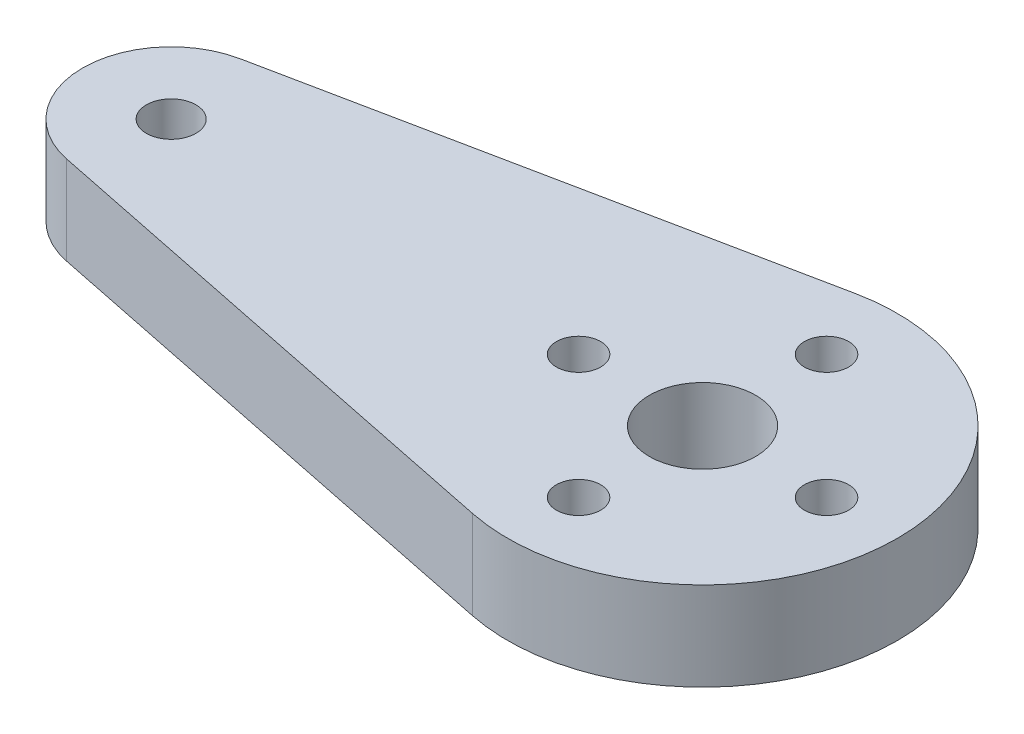
ISO-10303-21;
HEADER;
FILE_DESCRIPTION(('STEP AP214'),'2;1');
FILE_NAME('part.step','',(''),(''),'','','');
FILE_SCHEMA(('AUTOMOTIVE_DESIGN { 1 0 10303 214 1 1 1 1 }'));
ENDSEC;
DATA;
#1=APPLICATION_CONTEXT('core data for automotive mechanical design processes');
#2=APPLICATION_PROTOCOL_DEFINITION('international standard','automotive_design',2000,#1);
#3=PRODUCT_CONTEXT('',#1,'mechanical');
#4=PRODUCT('Part','Part','',(#3));
#5=PRODUCT_RELATED_PRODUCT_CATEGORY('part','',(#4));
#6=PRODUCT_DEFINITION_FORMATION('','',#4);
#7=PRODUCT_DEFINITION_CONTEXT('part definition',#1,'design');
#8=PRODUCT_DEFINITION('design','',#6,#7);
#9=PRODUCT_DEFINITION_SHAPE('','',#8);
#10=(LENGTH_UNIT() NAMED_UNIT(*) SI_UNIT(.MILLI.,.METRE.));
#11=(NAMED_UNIT(*) PLANE_ANGLE_UNIT() SI_UNIT($,.RADIAN.));
#12=(NAMED_UNIT(*) SI_UNIT($,.STERADIAN.) SOLID_ANGLE_UNIT());
#13=UNCERTAINTY_MEASURE_WITH_UNIT(LENGTH_MEASURE(1.E-05),#10,'distance_accuracy_value','');
#14=(GEOMETRIC_REPRESENTATION_CONTEXT(3) GLOBAL_UNCERTAINTY_ASSIGNED_CONTEXT((#13)) GLOBAL_UNIT_ASSIGNED_CONTEXT((#10,
#11,#12)) REPRESENTATION_CONTEXT('',''));
#15=CARTESIAN_POINT('',(0.,0.,0.));
#16=DIRECTION('',(0.,0.,1.));
#17=DIRECTION('',(1.,0.,0.));
#18=AXIS2_PLACEMENT_3D('',#15,#16,#17);
#19=CARTESIAN_POINT('',(0.,5.,0.));
#20=DIRECTION('',(0.,1.,0.));
#21=DIRECTION('',(0.,0.,1.));
#22=AXIS2_PLACEMENT_3D('',#19,#20,#21);
#23=PLANE('',#22);
#24=CARTESIAN_POINT('',(37.,5.,0.));
#25=DIRECTION('',(0.,1.,0.));
#26=DIRECTION('',(0.,0.,1.));
#27=AXIS2_PLACEMENT_3D('',#24,#25,#26);
#28=CIRCLE('',#27,1.25);
#29=CARTESIAN_POINT('',(37.,5.,1.25000000000005));
#30=VERTEX_POINT('',#29);
#31=EDGE_CURVE('E164',#30,#30,#28,.T.);
#32=ORIENTED_EDGE('',*,*,#31,.F.);
#33=EDGE_LOOP('',(#32));
#34=FACE_BOUND('',#33,.T.);
#35=CARTESIAN_POINT('',(0.,5.,0.));
#36=DIRECTION('',(0.,1.,0.));
#37=DIRECTION('',(0.,0.,1.));
#38=AXIS2_PLACEMENT_3D('',#35,#36,#37);
#39=CIRCLE('',#38,1.4);
#40=CARTESIAN_POINT('',(0.,5.,1.4));
#41=VERTEX_POINT('',#40);
#42=EDGE_CURVE('E148',#41,#41,#39,.T.);
#43=ORIENTED_EDGE('',*,*,#42,.F.);
#44=EDGE_LOOP('',(#43));
#45=FACE_BOUND('',#44,.T.);
#46=CARTESIAN_POINT('',(30.,5.,0.));
#47=DIRECTION('',(0.,1.,0.));
#48=DIRECTION('',(0.,0.,1.));
#49=AXIS2_PLACEMENT_3D('',#46,#47,#48);
#50=CIRCLE('',#49,3.);
#51=CARTESIAN_POINT('',(30.,5.,3.));
#52=VERTEX_POINT('',#51);
#53=EDGE_CURVE('E118',#52,#52,#50,.T.);
#54=ORIENTED_EDGE('',*,*,#53,.F.);
#55=EDGE_LOOP('',(#54));
#56=FACE_BOUND('',#55,.T.);
#57=CARTESIAN_POINT('',(0.,5.,0.));
#58=DIRECTION('',(0.,1.,0.));
#59=DIRECTION('',(0.,0.,1.));
#60=AXIS2_PLACEMENT_3D('',#57,#58,#59);
#61=CIRCLE('',#60,5.);
#62=CARTESIAN_POINT('',(-1.,5.,-4.89897948556636));
#63=VERTEX_POINT('',#62);
#64=CARTESIAN_POINT('',(-1.,5.,4.89897948556636));
#65=VERTEX_POINT('',#64);
#66=EDGE_CURVE('E98',#63,#65,#61,.T.);
#67=ORIENTED_EDGE('',*,*,#66,.T.);
#68=DIRECTION('',(0.979795897113271,0.,0.2));
#69=VECTOR('',#68,1.);
#70=CARTESIAN_POINT('',(-1.,5.,4.89897948556636));
#71=LINE('',#70,#69);
#72=CARTESIAN_POINT('',(27.8,5.,10.777754868246));
#73=VERTEX_POINT('',#72);
#74=EDGE_CURVE('E93',#65,#73,#71,.T.);
#75=ORIENTED_EDGE('',*,*,#74,.T.);
#76=CARTESIAN_POINT('',(30.,5.,0.));
#77=DIRECTION('',(0.,1.,0.));
#78=DIRECTION('',(0.,0.,1.));
#79=AXIS2_PLACEMENT_3D('',#76,#77,#78);
#80=CIRCLE('',#79,11.);
#81=CARTESIAN_POINT('',(27.8,5.,-10.777754868246));
#82=VERTEX_POINT('',#81);
#83=EDGE_CURVE('E96',#73,#82,#80,.T.);
#84=ORIENTED_EDGE('',*,*,#83,.T.);
#85=DIRECTION('',(-0.979795897113271,0.,0.2));
#86=VECTOR('',#85,1.);
#87=CARTESIAN_POINT('',(-1.,5.,-4.89897948556636));
#88=LINE('',#87,#86);
#89=EDGE_CURVE('E63',#82,#63,#88,.T.);
#90=ORIENTED_EDGE('',*,*,#89,.T.);
#91=EDGE_LOOP('',(#67,#75,#84,#90));
#92=FACE_BOUND('',#91,.T.);
#93=CARTESIAN_POINT('',(23.,5.,0.));
#94=DIRECTION('',(0.,1.,0.));
#95=DIRECTION('',(0.,0.,1.));
#96=AXIS2_PLACEMENT_3D('',#93,#94,#95);
#97=CIRCLE('',#96,1.25);
#98=CARTESIAN_POINT('',(23.,5.,1.25));
#99=VERTEX_POINT('',#98);
#100=EDGE_CURVE('E140',#99,#99,#97,.T.);
#101=ORIENTED_EDGE('',*,*,#100,.F.);
#102=EDGE_LOOP('',(#101));
#103=FACE_BOUND('',#102,.T.);
#104=CARTESIAN_POINT('',(30.,5.,-7.));
#105=DIRECTION('',(0.,1.,0.));
#106=DIRECTION('',(0.,0.,1.));
#107=AXIS2_PLACEMENT_3D('',#104,#105,#106);
#108=CIRCLE('',#107,1.25);
#109=CARTESIAN_POINT('',(30.,5.,-5.75));
#110=VERTEX_POINT('',#109);
#111=EDGE_CURVE('E156',#110,#110,#108,.T.);
#112=ORIENTED_EDGE('',*,*,#111,.F.);
#113=EDGE_LOOP('',(#112));
#114=FACE_BOUND('',#113,.T.);
#115=CARTESIAN_POINT('',(29.9999999999999,5.,7.));
#116=DIRECTION('',(0.,1.,0.));
#117=DIRECTION('',(0.,0.,1.));
#118=AXIS2_PLACEMENT_3D('',#115,#116,#117);
#119=CIRCLE('',#118,1.25);
#120=CARTESIAN_POINT('',(29.9999999999999,5.,8.25));
#121=VERTEX_POINT('',#120);
#122=EDGE_CURVE('E172',#121,#121,#119,.T.);
#123=ORIENTED_EDGE('',*,*,#122,.F.);
#124=EDGE_LOOP('',(#123));
#125=FACE_BOUND('',#124,.T.);
#126=ADVANCED_FACE('F45',(#34,#45,#56,#92,#103,#114,#125),#23,.T.);
#127=CARTESIAN_POINT('',(0.,0.,0.));
#128=DIRECTION('',(0.,1.,0.));
#129=DIRECTION('',(0.,0.,1.));
#130=AXIS2_PLACEMENT_3D('',#127,#128,#129);
#131=PLANE('',#130);
#132=CARTESIAN_POINT('',(0.,0.,0.));
#133=DIRECTION('',(0.,1.,0.));
#134=DIRECTION('',(0.,0.,1.));
#135=AXIS2_PLACEMENT_3D('',#132,#133,#134);
#136=CIRCLE('',#135,5.);
#137=CARTESIAN_POINT('',(-1.,0.,-4.89897948556636));
#138=VERTEX_POINT('',#137);
#139=CARTESIAN_POINT('',(-1.,0.,4.89897948556636));
#140=VERTEX_POINT('',#139);
#141=EDGE_CURVE('E114',#138,#140,#136,.T.);
#142=ORIENTED_EDGE('',*,*,#141,.F.);
#143=DIRECTION('',(-0.979795897113271,0.,0.2));
#144=VECTOR('',#143,1.);
#145=CARTESIAN_POINT('',(-1.,0.,-4.89897948556636));
#146=LINE('',#145,#144);
#147=CARTESIAN_POINT('',(27.8,0.,-10.777754868246));
#148=VERTEX_POINT('',#147);
#149=EDGE_CURVE('E86',#148,#138,#146,.T.);
#150=ORIENTED_EDGE('',*,*,#149,.F.);
#151=CARTESIAN_POINT('',(30.,0.,0.));
#152=DIRECTION('',(0.,1.,0.));
#153=DIRECTION('',(0.,0.,1.));
#154=AXIS2_PLACEMENT_3D('',#151,#152,#153);
#155=CIRCLE('',#154,11.);
#156=CARTESIAN_POINT('',(27.8,0.,10.777754868246));
#157=VERTEX_POINT('',#156);
#158=EDGE_CURVE('E80',#157,#148,#155,.T.);
#159=ORIENTED_EDGE('',*,*,#158,.F.);
#160=DIRECTION('',(0.979795897113271,0.,0.2));
#161=VECTOR('',#160,1.);
#162=CARTESIAN_POINT('',(-1.,0.,4.89897948556636));
#163=LINE('',#162,#161);
#164=EDGE_CURVE('E103',#140,#157,#163,.T.);
#165=ORIENTED_EDGE('',*,*,#164,.F.);
#166=EDGE_LOOP('',(#142,#150,#159,#165));
#167=FACE_BOUND('',#166,.T.);
#168=CARTESIAN_POINT('',(30.,0.,0.));
#169=DIRECTION('',(0.,1.,0.));
#170=DIRECTION('',(0.,0.,1.));
#171=AXIS2_PLACEMENT_3D('',#168,#169,#170);
#172=CIRCLE('',#171,3.);
#173=CARTESIAN_POINT('',(30.,0.,3.));
#174=VERTEX_POINT('',#173);
#175=EDGE_CURVE('E136',#174,#174,#172,.T.);
#176=ORIENTED_EDGE('',*,*,#175,.T.);
#177=EDGE_LOOP('',(#176));
#178=FACE_BOUND('',#177,.T.);
#179=CARTESIAN_POINT('',(23.,0.,0.));
#180=DIRECTION('',(0.,1.,0.));
#181=DIRECTION('',(0.,0.,1.));
#182=AXIS2_PLACEMENT_3D('',#179,#180,#181);
#183=CIRCLE('',#182,1.25);
#184=CARTESIAN_POINT('',(23.,0.,1.25));
#185=VERTEX_POINT('',#184);
#186=EDGE_CURVE('E144',#185,#185,#183,.T.);
#187=ORIENTED_EDGE('',*,*,#186,.T.);
#188=EDGE_LOOP('',(#187));
#189=FACE_BOUND('',#188,.T.);
#190=CARTESIAN_POINT('',(0.,0.,0.));
#191=DIRECTION('',(0.,1.,0.));
#192=DIRECTION('',(0.,0.,1.));
#193=AXIS2_PLACEMENT_3D('',#190,#191,#192);
#194=CIRCLE('',#193,1.4);
#195=CARTESIAN_POINT('',(0.,0.,1.4));
#196=VERTEX_POINT('',#195);
#197=EDGE_CURVE('E152',#196,#196,#194,.T.);
#198=ORIENTED_EDGE('',*,*,#197,.T.);
#199=EDGE_LOOP('',(#198));
#200=FACE_BOUND('',#199,.T.);
#201=CARTESIAN_POINT('',(30.,0.,-7.));
#202=DIRECTION('',(0.,1.,0.));
#203=DIRECTION('',(0.,0.,1.));
#204=AXIS2_PLACEMENT_3D('',#201,#202,#203);
#205=CIRCLE('',#204,1.25);
#206=CARTESIAN_POINT('',(30.,0.,-5.75));
#207=VERTEX_POINT('',#206);
#208=EDGE_CURVE('E160',#207,#207,#205,.T.);
#209=ORIENTED_EDGE('',*,*,#208,.T.);
#210=EDGE_LOOP('',(#209));
#211=FACE_BOUND('',#210,.T.);
#212=CARTESIAN_POINT('',(37.,0.,0.));
#213=DIRECTION('',(0.,1.,0.));
#214=DIRECTION('',(0.,0.,1.));
#215=AXIS2_PLACEMENT_3D('',#212,#213,#214);
#216=CIRCLE('',#215,1.25);
#217=CARTESIAN_POINT('',(37.,0.,1.25000000000005));
#218=VERTEX_POINT('',#217);
#219=EDGE_CURVE('E168',#218,#218,#216,.T.);
#220=ORIENTED_EDGE('',*,*,#219,.T.);
#221=EDGE_LOOP('',(#220));
#222=FACE_BOUND('',#221,.T.);
#223=CARTESIAN_POINT('',(29.9999999999999,0.,7.));
#224=DIRECTION('',(0.,1.,0.));
#225=DIRECTION('',(0.,0.,1.));
#226=AXIS2_PLACEMENT_3D('',#223,#224,#225);
#227=CIRCLE('',#226,1.25);
#228=CARTESIAN_POINT('',(29.9999999999999,0.,8.25));
#229=VERTEX_POINT('',#228);
#230=EDGE_CURVE('E176',#229,#229,#227,.T.);
#231=ORIENTED_EDGE('',*,*,#230,.T.);
#232=EDGE_LOOP('',(#231));
#233=FACE_BOUND('',#232,.T.);
#234=ADVANCED_FACE('F131',(#167,#178,#189,#200,#211,#222,#233),#131,.F.);
#235=CARTESIAN_POINT('',(0.,5.,0.));
#236=DIRECTION('',(0.,-1.,0.));
#237=DIRECTION('',(0.,0.,-1.));
#238=AXIS2_PLACEMENT_3D('',#235,#236,#237);
#239=CYLINDRICAL_SURFACE('',#238,5.);
#240=ORIENTED_EDGE('',*,*,#141,.T.);
#241=DIRECTION('',(0.,-1.,0.));
#242=VECTOR('',#241,1.);
#243=CARTESIAN_POINT('',(-1.,5.,4.89897948556636));
#244=LINE('',#243,#242);
#245=EDGE_CURVE('E11',#65,#140,#244,.T.);
#246=ORIENTED_EDGE('',*,*,#245,.F.);
#247=ORIENTED_EDGE('',*,*,#66,.F.);
#248=DIRECTION('',(0.,-1.,0.));
#249=VECTOR('',#248,1.);
#250=CARTESIAN_POINT('',(-1.,5.,-4.89897948556636));
#251=LINE('',#250,#249);
#252=EDGE_CURVE('E110',#63,#138,#251,.T.);
#253=ORIENTED_EDGE('',*,*,#252,.T.);
#254=EDGE_LOOP('',(#240,#246,#247,#253));
#255=FACE_BOUND('',#254,.T.);
#256=ADVANCED_FACE('F47',(#255),#239,.T.);
#257=CARTESIAN_POINT('',(-1.,5.,4.89897948556636));
#258=DIRECTION('',(0.2,0.,-0.979795897113271));
#259=DIRECTION('',(-0.979795897113271,0.,-0.2));
#260=AXIS2_PLACEMENT_3D('',#257,#258,#259);
#261=PLANE('',#260);
#262=ORIENTED_EDGE('',*,*,#164,.T.);
#263=DIRECTION('',(0.,-1.,0.));
#264=VECTOR('',#263,1.);
#265=CARTESIAN_POINT('',(27.8,5.,10.777754868246));
#266=LINE('',#265,#264);
#267=EDGE_CURVE('E55',#73,#157,#266,.T.);
#268=ORIENTED_EDGE('',*,*,#267,.F.);
#269=ORIENTED_EDGE('',*,*,#74,.F.);
#270=ORIENTED_EDGE('',*,*,#245,.T.);
#271=EDGE_LOOP('',(#262,#268,#269,#270));
#272=FACE_BOUND('',#271,.T.);
#273=ADVANCED_FACE('F102',(#272),#261,.F.);
#274=CARTESIAN_POINT('',(30.,5.,0.));
#275=DIRECTION('',(0.,-1.,0.));
#276=DIRECTION('',(0.,0.,-1.));
#277=AXIS2_PLACEMENT_3D('',#274,#275,#276);
#278=CYLINDRICAL_SURFACE('',#277,11.);
#279=ORIENTED_EDGE('',*,*,#158,.T.);
#280=DIRECTION('',(0.,-1.,0.));
#281=VECTOR('',#280,1.);
#282=CARTESIAN_POINT('',(27.8,5.,-10.777754868246));
#283=LINE('',#282,#281);
#284=EDGE_CURVE('E105',#82,#148,#283,.T.);
#285=ORIENTED_EDGE('',*,*,#284,.F.);
#286=ORIENTED_EDGE('',*,*,#83,.F.);
#287=ORIENTED_EDGE('',*,*,#267,.T.);
#288=EDGE_LOOP('',(#279,#285,#286,#287));
#289=FACE_BOUND('',#288,.T.);
#290=ADVANCED_FACE('F106',(#289),#278,.T.);
#291=CARTESIAN_POINT('',(-1.,5.,-4.89897948556636));
#292=DIRECTION('',(0.2,0.,0.979795897113271));
#293=DIRECTION('',(0.979795897113271,0.,-0.2));
#294=AXIS2_PLACEMENT_3D('',#291,#292,#293);
#295=PLANE('',#294);
#296=ORIENTED_EDGE('',*,*,#149,.T.);
#297=ORIENTED_EDGE('',*,*,#252,.F.);
#298=ORIENTED_EDGE('',*,*,#89,.F.);
#299=ORIENTED_EDGE('',*,*,#284,.T.);
#300=EDGE_LOOP('',(#296,#297,#298,#299));
#301=FACE_BOUND('',#300,.T.);
#302=ADVANCED_FACE('F128',(#301),#295,.F.);
#303=CARTESIAN_POINT('',(30.,5.,0.));
#304=DIRECTION('',(0.,-1.,0.));
#305=DIRECTION('',(0.,0.,-1.));
#306=AXIS2_PLACEMENT_3D('',#303,#304,#305);
#307=CYLINDRICAL_SURFACE('',#306,3.);
#308=ORIENTED_EDGE('',*,*,#53,.T.);
#309=EDGE_LOOP('',(#308));
#310=FACE_BOUND('',#309,.T.);
#311=ORIENTED_EDGE('',*,*,#175,.F.);
#312=EDGE_LOOP('',(#311));
#313=FACE_BOUND('',#312,.T.);
#314=ADVANCED_FACE('F197',(#310,#313),#307,.F.);
#315=CARTESIAN_POINT('',(23.,5.,0.));
#316=DIRECTION('',(0.,-1.,0.));
#317=DIRECTION('',(0.,0.,-1.));
#318=AXIS2_PLACEMENT_3D('',#315,#316,#317);
#319=CYLINDRICAL_SURFACE('',#318,1.25);
#320=ORIENTED_EDGE('',*,*,#100,.T.);
#321=EDGE_LOOP('',(#320));
#322=FACE_BOUND('',#321,.T.);
#323=ORIENTED_EDGE('',*,*,#186,.F.);
#324=EDGE_LOOP('',(#323));
#325=FACE_BOUND('',#324,.T.);
#326=ADVANCED_FACE('F242',(#322,#325),#319,.F.);
#327=CARTESIAN_POINT('',(0.,5.,0.));
#328=DIRECTION('',(0.,-1.,0.));
#329=DIRECTION('',(0.,0.,-1.));
#330=AXIS2_PLACEMENT_3D('',#327,#328,#329);
#331=CYLINDRICAL_SURFACE('',#330,1.4);
#332=ORIENTED_EDGE('',*,*,#42,.T.);
#333=EDGE_LOOP('',(#332));
#334=FACE_BOUND('',#333,.T.);
#335=ORIENTED_EDGE('',*,*,#197,.F.);
#336=EDGE_LOOP('',(#335));
#337=FACE_BOUND('',#336,.T.);
#338=ADVANCED_FACE('F250',(#334,#337),#331,.F.);
#339=CARTESIAN_POINT('',(30.,5.,-7.));
#340=DIRECTION('',(0.,-1.,0.));
#341=DIRECTION('',(0.,0.,-1.));
#342=AXIS2_PLACEMENT_3D('',#339,#340,#341);
#343=CYLINDRICAL_SURFACE('',#342,1.25);
#344=ORIENTED_EDGE('',*,*,#111,.T.);
#345=EDGE_LOOP('',(#344));
#346=FACE_BOUND('',#345,.T.);
#347=ORIENTED_EDGE('',*,*,#208,.F.);
#348=EDGE_LOOP('',(#347));
#349=FACE_BOUND('',#348,.T.);
#350=ADVANCED_FACE('F258',(#346,#349),#343,.F.);
#351=CARTESIAN_POINT('',(37.,5.,0.));
#352=DIRECTION('',(0.,-1.,0.));
#353=DIRECTION('',(0.,0.,-1.));
#354=AXIS2_PLACEMENT_3D('',#351,#352,#353);
#355=CYLINDRICAL_SURFACE('',#354,1.25);
#356=ORIENTED_EDGE('',*,*,#31,.T.);
#357=EDGE_LOOP('',(#356));
#358=FACE_BOUND('',#357,.T.);
#359=ORIENTED_EDGE('',*,*,#219,.F.);
#360=EDGE_LOOP('',(#359));
#361=FACE_BOUND('',#360,.T.);
#362=ADVANCED_FACE('F267',(#358,#361),#355,.F.);
#363=CARTESIAN_POINT('',(29.9999999999999,5.,7.));
#364=DIRECTION('',(0.,-1.,0.));
#365=DIRECTION('',(0.,0.,-1.));
#366=AXIS2_PLACEMENT_3D('',#363,#364,#365);
#367=CYLINDRICAL_SURFACE('',#366,1.25);
#368=ORIENTED_EDGE('',*,*,#122,.T.);
#369=EDGE_LOOP('',(#368));
#370=FACE_BOUND('',#369,.T.);
#371=ORIENTED_EDGE('',*,*,#230,.F.);
#372=EDGE_LOOP('',(#371));
#373=FACE_BOUND('',#372,.T.);
#374=ADVANCED_FACE('F184',(#370,#373),#367,.F.);
#375=CLOSED_SHELL('',(#126,#234,#256,#273,#290,#302,#314,#326,#338,#350,#362,#374));
#376=MANIFOLD_SOLID_BREP('B2',#375);
#377=ADVANCED_BREP_SHAPE_REPRESENTATION('',(#18,#376),#14);
#378=SHAPE_DEFINITION_REPRESENTATION(#9,#377);
ENDSEC;
END-ISO-10303-21;
